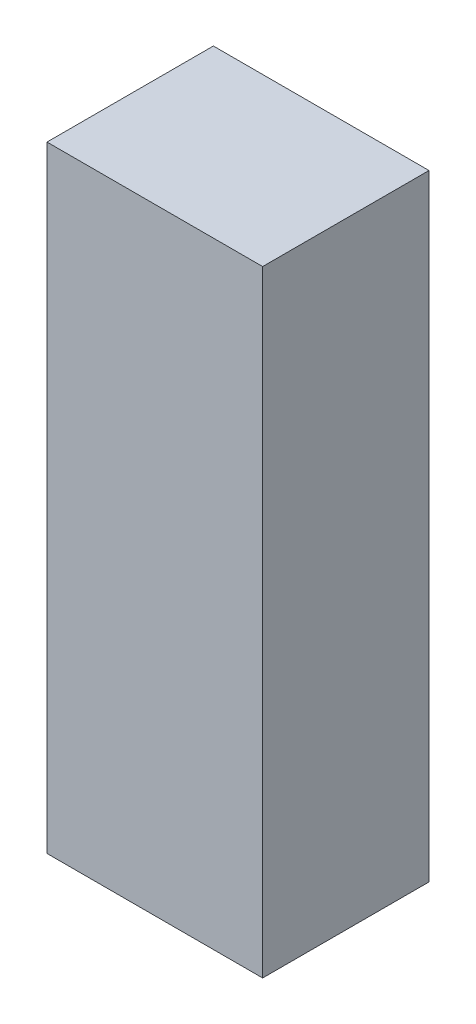
ISO-10303-21;
HEADER;
FILE_DESCRIPTION(('STEP AP214'),'2;1');
FILE_NAME('part.step','',(''),(''),'','','');
FILE_SCHEMA(('AUTOMOTIVE_DESIGN { 1 0 10303 214 1 1 1 1 }'));
ENDSEC;
DATA;
#1=APPLICATION_CONTEXT('core data for automotive mechanical design processes');
#2=APPLICATION_PROTOCOL_DEFINITION('international standard','automotive_design',2000,#1);
#3=PRODUCT_CONTEXT('',#1,'mechanical');
#4=PRODUCT('Part','Part','',(#3));
#5=PRODUCT_RELATED_PRODUCT_CATEGORY('part','',(#4));
#6=PRODUCT_DEFINITION_FORMATION('','',#4);
#7=PRODUCT_DEFINITION_CONTEXT('part definition',#1,'design');
#8=PRODUCT_DEFINITION('design','',#6,#7);
#9=PRODUCT_DEFINITION_SHAPE('','',#8);
#10=(LENGTH_UNIT() NAMED_UNIT(*) SI_UNIT(.MILLI.,.METRE.));
#11=(NAMED_UNIT(*) PLANE_ANGLE_UNIT() SI_UNIT($,.RADIAN.));
#12=(NAMED_UNIT(*) SI_UNIT($,.STERADIAN.) SOLID_ANGLE_UNIT());
#13=UNCERTAINTY_MEASURE_WITH_UNIT(LENGTH_MEASURE(1.E-05),#10,'distance_accuracy_value','');
#14=(GEOMETRIC_REPRESENTATION_CONTEXT(3) GLOBAL_UNCERTAINTY_ASSIGNED_CONTEXT((#13)) GLOBAL_UNIT_ASSIGNED_CONTEXT((#10,
#11,#12)) REPRESENTATION_CONTEXT('',''));
#15=CARTESIAN_POINT('',(0.,0.,0.));
#16=DIRECTION('',(0.,0.,1.));
#17=DIRECTION('',(1.,0.,0.));
#18=AXIS2_PLACEMENT_3D('',#15,#16,#17);
#19=CARTESIAN_POINT('',(-17.5,50.,27.));
#20=DIRECTION('',(1.,0.,0.));
#21=DIRECTION('',(0.,0.,-1.));
#22=AXIS2_PLACEMENT_3D('',#19,#20,#21);
#23=PLANE('',#22);
#24=DIRECTION('',(0.,-1.,0.));
#25=VECTOR('',#24,1.);
#26=CARTESIAN_POINT('',(-17.5,50.,0.));
#27=LINE('',#26,#25);
#28=CARTESIAN_POINT('',(-17.5,50.,0.));
#29=VERTEX_POINT('',#28);
#30=CARTESIAN_POINT('',(-17.5,-50.,0.));
#31=VERTEX_POINT('',#30);
#32=EDGE_CURVE('E102',#29,#31,#27,.T.);
#33=ORIENTED_EDGE('',*,*,#32,.T.);
#34=DIRECTION('',(0.,0.,-1.));
#35=VECTOR('',#34,1.);
#36=CARTESIAN_POINT('',(-17.5,-50.,27.));
#37=LINE('',#36,#35);
#38=CARTESIAN_POINT('',(-17.5,-50.,27.));
#39=VERTEX_POINT('',#38);
#40=EDGE_CURVE('E11',#39,#31,#37,.T.);
#41=ORIENTED_EDGE('',*,*,#40,.F.);
#42=DIRECTION('',(0.,-1.,0.));
#43=VECTOR('',#42,1.);
#44=CARTESIAN_POINT('',(-17.5,50.,27.));
#45=LINE('',#44,#43);
#46=CARTESIAN_POINT('',(-17.5,50.,27.));
#47=VERTEX_POINT('',#46);
#48=EDGE_CURVE('E90',#47,#39,#45,.T.);
#49=ORIENTED_EDGE('',*,*,#48,.F.);
#50=DIRECTION('',(0.,0.,-1.));
#51=VECTOR('',#50,1.);
#52=CARTESIAN_POINT('',(-17.5,50.,27.));
#53=LINE('',#52,#51);
#54=EDGE_CURVE('E98',#47,#29,#53,.T.);
#55=ORIENTED_EDGE('',*,*,#54,.T.);
#56=EDGE_LOOP('',(#33,#41,#49,#55));
#57=FACE_BOUND('',#56,.T.);
#58=ADVANCED_FACE('F39',(#57),#23,.F.);
#59=CARTESIAN_POINT('',(-17.5,-50.,27.));
#60=DIRECTION('',(0.,1.,0.));
#61=DIRECTION('',(0.,0.,1.));
#62=AXIS2_PLACEMENT_3D('',#59,#60,#61);
#63=PLANE('',#62);
#64=DIRECTION('',(1.,0.,0.));
#65=VECTOR('',#64,1.);
#66=CARTESIAN_POINT('',(-17.5,-50.,0.));
#67=LINE('',#66,#65);
#68=CARTESIAN_POINT('',(17.5,-50.,0.));
#69=VERTEX_POINT('',#68);
#70=EDGE_CURVE('E94',#31,#69,#67,.T.);
#71=ORIENTED_EDGE('',*,*,#70,.T.);
#72=DIRECTION('',(0.,0.,-1.));
#73=VECTOR('',#72,1.);
#74=CARTESIAN_POINT('',(17.5,-50.,27.));
#75=LINE('',#74,#73);
#76=CARTESIAN_POINT('',(17.5,-50.,27.));
#77=VERTEX_POINT('',#76);
#78=EDGE_CURVE('E47',#77,#69,#75,.T.);
#79=ORIENTED_EDGE('',*,*,#78,.F.);
#80=DIRECTION('',(1.,0.,0.));
#81=VECTOR('',#80,1.);
#82=CARTESIAN_POINT('',(-17.5,-50.,27.));
#83=LINE('',#82,#81);
#84=EDGE_CURVE('E85',#39,#77,#83,.T.);
#85=ORIENTED_EDGE('',*,*,#84,.F.);
#86=ORIENTED_EDGE('',*,*,#40,.T.);
#87=EDGE_LOOP('',(#71,#79,#85,#86));
#88=FACE_BOUND('',#87,.T.);
#89=ADVANCED_FACE('F93',(#88),#63,.F.);
#90=CARTESIAN_POINT('',(17.5,-50.,27.));
#91=DIRECTION('',(-1.,0.,0.));
#92=DIRECTION('',(0.,0.,1.));
#93=AXIS2_PLACEMENT_3D('',#90,#91,#92);
#94=PLANE('',#93);
#95=DIRECTION('',(0.,1.,0.));
#96=VECTOR('',#95,1.);
#97=CARTESIAN_POINT('',(17.5,-50.,0.));
#98=LINE('',#97,#96);
#99=CARTESIAN_POINT('',(17.5,50.,0.));
#100=VERTEX_POINT('',#99);
#101=EDGE_CURVE('E72',#69,#100,#98,.T.);
#102=ORIENTED_EDGE('',*,*,#101,.T.);
#103=DIRECTION('',(0.,0.,-1.));
#104=VECTOR('',#103,1.);
#105=CARTESIAN_POINT('',(17.5,50.,27.));
#106=LINE('',#105,#104);
#107=CARTESIAN_POINT('',(17.5,50.,27.));
#108=VERTEX_POINT('',#107);
#109=EDGE_CURVE('E95',#108,#100,#106,.T.);
#110=ORIENTED_EDGE('',*,*,#109,.F.);
#111=DIRECTION('',(0.,1.,0.));
#112=VECTOR('',#111,1.);
#113=CARTESIAN_POINT('',(17.5,-50.,27.));
#114=LINE('',#113,#112);
#115=EDGE_CURVE('E88',#77,#108,#114,.T.);
#116=ORIENTED_EDGE('',*,*,#115,.F.);
#117=ORIENTED_EDGE('',*,*,#78,.T.);
#118=EDGE_LOOP('',(#102,#110,#116,#117));
#119=FACE_BOUND('',#118,.T.);
#120=ADVANCED_FACE('F96',(#119),#94,.F.);
#121=CARTESIAN_POINT('',(17.5,50.,27.));
#122=DIRECTION('',(0.,-1.,0.));
#123=DIRECTION('',(0.,0.,-1.));
#124=AXIS2_PLACEMENT_3D('',#121,#122,#123);
#125=PLANE('',#124);
#126=DIRECTION('',(-1.,0.,0.));
#127=VECTOR('',#126,1.);
#128=CARTESIAN_POINT('',(17.5,50.,0.));
#129=LINE('',#128,#127);
#130=EDGE_CURVE('E78',#100,#29,#129,.T.);
#131=ORIENTED_EDGE('',*,*,#130,.T.);
#132=ORIENTED_EDGE('',*,*,#54,.F.);
#133=DIRECTION('',(-1.,0.,0.));
#134=VECTOR('',#133,1.);
#135=CARTESIAN_POINT('',(17.5,50.,27.));
#136=LINE('',#135,#134);
#137=EDGE_CURVE('E55',#108,#47,#136,.T.);
#138=ORIENTED_EDGE('',*,*,#137,.F.);
#139=ORIENTED_EDGE('',*,*,#109,.T.);
#140=EDGE_LOOP('',(#131,#132,#138,#139));
#141=FACE_BOUND('',#140,.T.);
#142=ADVANCED_FACE('F109',(#141),#125,.F.);
#143=CARTESIAN_POINT('',(0.,0.,27.));
#144=DIRECTION('',(0.,0.,1.));
#145=DIRECTION('',(1.,0.,0.));
#146=AXIS2_PLACEMENT_3D('',#143,#144,#145);
#147=PLANE('',#146);
#148=ORIENTED_EDGE('',*,*,#48,.T.);
#149=ORIENTED_EDGE('',*,*,#84,.T.);
#150=ORIENTED_EDGE('',*,*,#115,.T.);
#151=ORIENTED_EDGE('',*,*,#137,.T.);
#152=EDGE_LOOP('',(#148,#149,#150,#151));
#153=FACE_BOUND('',#152,.T.);
#154=ADVANCED_FACE('F86',(#153),#147,.T.);
#155=CARTESIAN_POINT('',(0.,0.,0.));
#156=DIRECTION('',(0.,0.,1.));
#157=DIRECTION('',(1.,0.,0.));
#158=AXIS2_PLACEMENT_3D('',#155,#156,#157);
#159=PLANE('',#158);
#160=ORIENTED_EDGE('',*,*,#32,.F.);
#161=ORIENTED_EDGE('',*,*,#130,.F.);
#162=ORIENTED_EDGE('',*,*,#101,.F.);
#163=ORIENTED_EDGE('',*,*,#70,.F.);
#164=EDGE_LOOP('',(#160,#161,#162,#163));
#165=FACE_BOUND('',#164,.T.);
#166=ADVANCED_FACE('F112',(#165),#159,.F.);
#167=CLOSED_SHELL('',(#58,#89,#120,#142,#154,#166));
#168=MANIFOLD_SOLID_BREP('B2',#167);
#169=ADVANCED_BREP_SHAPE_REPRESENTATION('',(#18,#168),#14);
#170=SHAPE_DEFINITION_REPRESENTATION(#9,#169);
ENDSEC;
END-ISO-10303-21;
